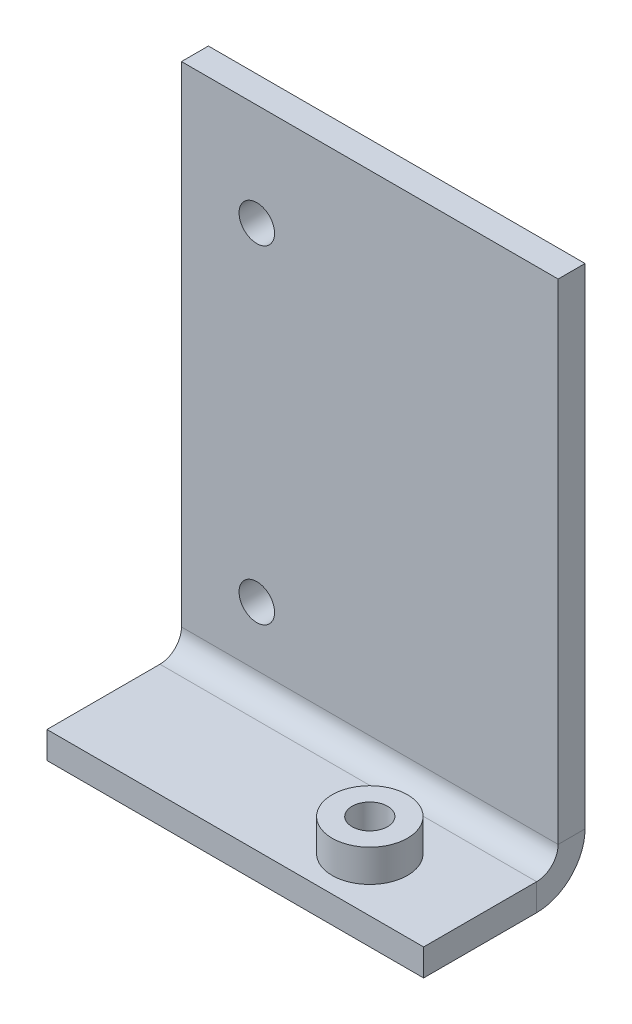
ISO-10303-21;
HEADER;
FILE_DESCRIPTION(('STEP AP214'),'2;1');
FILE_NAME('part.step','',(''),(''),'','','');
FILE_SCHEMA(('AUTOMOTIVE_DESIGN { 1 0 10303 214 1 1 1 1 }'));
ENDSEC;
DATA;
#1=APPLICATION_CONTEXT('core data for automotive mechanical design processes');
#2=APPLICATION_PROTOCOL_DEFINITION('international standard','automotive_design',2000,#1);
#3=PRODUCT_CONTEXT('',#1,'mechanical');
#4=PRODUCT('Part','Part','',(#3));
#5=PRODUCT_RELATED_PRODUCT_CATEGORY('part','',(#4));
#6=PRODUCT_DEFINITION_FORMATION('','',#4);
#7=PRODUCT_DEFINITION_CONTEXT('part definition',#1,'design');
#8=PRODUCT_DEFINITION('design','',#6,#7);
#9=PRODUCT_DEFINITION_SHAPE('','',#8);
#10=(LENGTH_UNIT() NAMED_UNIT(*) SI_UNIT(.MILLI.,.METRE.));
#11=(NAMED_UNIT(*) PLANE_ANGLE_UNIT() SI_UNIT($,.RADIAN.));
#12=(NAMED_UNIT(*) SI_UNIT($,.STERADIAN.) SOLID_ANGLE_UNIT());
#13=UNCERTAINTY_MEASURE_WITH_UNIT(LENGTH_MEASURE(1.E-05),#10,'distance_accuracy_value','');
#14=(GEOMETRIC_REPRESENTATION_CONTEXT(3) GLOBAL_UNCERTAINTY_ASSIGNED_CONTEXT((#13)) GLOBAL_UNIT_ASSIGNED_CONTEXT((#10,
#11,#12)) REPRESENTATION_CONTEXT('',''));
#15=CARTESIAN_POINT('',(0.,0.,0.));
#16=DIRECTION('',(0.,0.,1.));
#17=DIRECTION('',(1.,0.,0.));
#18=AXIS2_PLACEMENT_3D('',#15,#16,#17);
#19=CARTESIAN_POINT('',(35.,0.,2.5));
#20=DIRECTION('',(-1.,0.,0.));
#21=DIRECTION('',(0.,1.,0.));
#22=AXIS2_PLACEMENT_3D('',#19,#20,#21);
#23=PLANE('',#22);
#24=DIRECTION('',(0.,1.,0.));
#25=VECTOR('',#24,1.);
#26=CARTESIAN_POINT('',(35.,0.,2.5));
#27=LINE('',#26,#25);
#28=CARTESIAN_POINT('',(35.,4.49999999999999,2.5));
#29=VERTEX_POINT('',#28);
#30=CARTESIAN_POINT('',(35.,50.,2.5));
#31=VERTEX_POINT('',#30);
#32=EDGE_CURVE('E196',#29,#31,#27,.T.);
#33=ORIENTED_EDGE('',*,*,#32,.F.);
#34=DIRECTION('',(0.,0.,-1.));
#35=VECTOR('',#34,1.);
#36=CARTESIAN_POINT('',(35.,4.49999999999999,2.5));
#37=LINE('',#36,#35);
#38=CARTESIAN_POINT('',(35.,4.49999999999999,0.));
#39=VERTEX_POINT('',#38);
#40=EDGE_CURVE('E145',#29,#39,#37,.T.);
#41=ORIENTED_EDGE('',*,*,#40,.T.);
#42=DIRECTION('',(0.,1.,0.));
#43=VECTOR('',#42,1.);
#44=CARTESIAN_POINT('',(35.,0.,0.));
#45=LINE('',#44,#43);
#46=CARTESIAN_POINT('',(35.,50.,0.));
#47=VERTEX_POINT('',#46);
#48=EDGE_CURVE('E99',#39,#47,#45,.T.);
#49=ORIENTED_EDGE('',*,*,#48,.T.);
#50=DIRECTION('',(0.,0.,1.));
#51=VECTOR('',#50,1.);
#52=CARTESIAN_POINT('',(35.,50.,2.5));
#53=LINE('',#52,#51);
#54=EDGE_CURVE('E13',#47,#31,#53,.T.);
#55=ORIENTED_EDGE('',*,*,#54,.T.);
#56=EDGE_LOOP('',(#33,#41,#49,#55));
#57=FACE_BOUND('',#56,.T.);
#58=ADVANCED_FACE('F64',(#57),#23,.F.);
#59=CARTESIAN_POINT('',(0.,0.,2.5));
#60=DIRECTION('',(0.,0.,-1.));
#61=DIRECTION('',(-1.,0.,0.));
#62=AXIS2_PLACEMENT_3D('',#59,#60,#61);
#63=PLANE('',#62);
#64=CARTESIAN_POINT('',(7.00000000000003,40.5,2.5));
#65=DIRECTION('',(0.,0.,1.));
#66=DIRECTION('',(1.,0.,0.));
#67=AXIS2_PLACEMENT_3D('',#64,#65,#66);
#68=CIRCLE('',#67,1.65);
#69=CARTESIAN_POINT('',(8.65000000000003,40.5,2.5));
#70=VERTEX_POINT('',#69);
#71=EDGE_CURVE('E189',#70,#70,#68,.T.);
#72=ORIENTED_EDGE('',*,*,#71,.F.);
#73=EDGE_LOOP('',(#72));
#74=FACE_BOUND('',#73,.T.);
#75=CARTESIAN_POINT('',(7.00000000000035,10.,2.5));
#76=DIRECTION('',(0.,0.,1.));
#77=DIRECTION('',(1.,0.,0.));
#78=AXIS2_PLACEMENT_3D('',#75,#76,#77);
#79=CIRCLE('',#78,1.65);
#80=CARTESIAN_POINT('',(8.65000000000035,10.,2.5));
#81=VERTEX_POINT('',#80);
#82=EDGE_CURVE('E186',#81,#81,#79,.T.);
#83=ORIENTED_EDGE('',*,*,#82,.F.);
#84=EDGE_LOOP('',(#83));
#85=FACE_BOUND('',#84,.T.);
#86=DIRECTION('',(1.,0.,0.));
#87=VECTOR('',#86,1.);
#88=CARTESIAN_POINT('',(35.,4.49999999999999,2.5));
#89=LINE('',#88,#87);
#90=CARTESIAN_POINT('',(0.,4.49999999999999,2.5));
#91=VERTEX_POINT('',#90);
#92=EDGE_CURVE('E146',#29,#91,#89,.F.);
#93=ORIENTED_EDGE('',*,*,#92,.F.);
#94=ORIENTED_EDGE('',*,*,#32,.T.);
#95=DIRECTION('',(-1.,0.,0.));
#96=VECTOR('',#95,1.);
#97=CARTESIAN_POINT('',(0.,50.,2.5));
#98=LINE('',#97,#96);
#99=CARTESIAN_POINT('',(0.,50.,2.5));
#100=VERTEX_POINT('',#99);
#101=EDGE_CURVE('E198',#31,#100,#98,.T.);
#102=ORIENTED_EDGE('',*,*,#101,.T.);
#103=DIRECTION('',(0.,-1.,0.));
#104=VECTOR('',#103,1.);
#105=CARTESIAN_POINT('',(0.,0.,2.5));
#106=LINE('',#105,#104);
#107=EDGE_CURVE('E193',#100,#91,#106,.T.);
#108=ORIENTED_EDGE('',*,*,#107,.T.);
#109=EDGE_LOOP('',(#93,#94,#102,#108));
#110=FACE_BOUND('',#109,.T.);
#111=ADVANCED_FACE('F219',(#74,#85,#110),#63,.F.);
#112=CARTESIAN_POINT('',(0.,0.,0.));
#113=DIRECTION('',(0.,0.,-1.));
#114=DIRECTION('',(-1.,0.,0.));
#115=AXIS2_PLACEMENT_3D('',#112,#113,#114);
#116=PLANE('',#115);
#117=CARTESIAN_POINT('',(7.00000000000035,10.,0.));
#118=DIRECTION('',(0.,0.,1.));
#119=DIRECTION('',(1.,0.,0.));
#120=AXIS2_PLACEMENT_3D('',#117,#118,#119);
#121=CIRCLE('',#120,1.65);
#122=CARTESIAN_POINT('',(8.65000000000035,10.,0.));
#123=VERTEX_POINT('',#122);
#124=EDGE_CURVE('E184',#123,#123,#121,.T.);
#125=ORIENTED_EDGE('',*,*,#124,.T.);
#126=EDGE_LOOP('',(#125));
#127=FACE_BOUND('',#126,.T.);
#128=CARTESIAN_POINT('',(7.00000000000003,40.5,0.));
#129=DIRECTION('',(0.,0.,1.));
#130=DIRECTION('',(1.,0.,0.));
#131=AXIS2_PLACEMENT_3D('',#128,#129,#130);
#132=CIRCLE('',#131,1.65);
#133=CARTESIAN_POINT('',(8.65000000000003,40.5,0.));
#134=VERTEX_POINT('',#133);
#135=EDGE_CURVE('E203',#134,#134,#132,.T.);
#136=ORIENTED_EDGE('',*,*,#135,.T.);
#137=EDGE_LOOP('',(#136));
#138=FACE_BOUND('',#137,.T.);
#139=ORIENTED_EDGE('',*,*,#48,.F.);
#140=DIRECTION('',(1.,0.,0.));
#141=VECTOR('',#140,1.);
#142=CARTESIAN_POINT('',(35.,4.49999999999999,0.));
#143=LINE('',#142,#141);
#144=CARTESIAN_POINT('',(0.,4.50000000000001,0.));
#145=VERTEX_POINT('',#144);
#146=EDGE_CURVE('E105',#39,#145,#143,.F.);
#147=ORIENTED_EDGE('',*,*,#146,.T.);
#148=DIRECTION('',(0.,1.,0.));
#149=VECTOR('',#148,1.);
#150=CARTESIAN_POINT('',(0.,0.,0.));
#151=LINE('',#150,#149);
#152=CARTESIAN_POINT('',(0.,50.,0.));
#153=VERTEX_POINT('',#152);
#154=EDGE_CURVE('E206',#153,#145,#151,.F.);
#155=ORIENTED_EDGE('',*,*,#154,.F.);
#156=DIRECTION('',(-1.,0.,0.));
#157=VECTOR('',#156,1.);
#158=CARTESIAN_POINT('',(0.,50.,0.));
#159=LINE('',#158,#157);
#160=EDGE_CURVE('E190',#47,#153,#159,.T.);
#161=ORIENTED_EDGE('',*,*,#160,.F.);
#162=EDGE_LOOP('',(#139,#147,#155,#161));
#163=FACE_BOUND('',#162,.T.);
#164=ADVANCED_FACE('F214',(#127,#138,#163),#116,.T.);
#165=CARTESIAN_POINT('',(0.,50.,2.5));
#166=DIRECTION('',(0.,-1.,0.));
#167=DIRECTION('',(-1.,0.,0.));
#168=AXIS2_PLACEMENT_3D('',#165,#166,#167);
#169=PLANE('',#168);
#170=ORIENTED_EDGE('',*,*,#54,.F.);
#171=ORIENTED_EDGE('',*,*,#160,.T.);
#172=DIRECTION('',(0.,0.,1.));
#173=VECTOR('',#172,1.);
#174=CARTESIAN_POINT('',(0.,50.,2.5));
#175=LINE('',#174,#173);
#176=EDGE_CURVE('E71',#153,#100,#175,.T.);
#177=ORIENTED_EDGE('',*,*,#176,.T.);
#178=ORIENTED_EDGE('',*,*,#101,.F.);
#179=EDGE_LOOP('',(#170,#171,#177,#178));
#180=FACE_BOUND('',#179,.T.);
#181=ADVANCED_FACE('F211',(#180),#169,.F.);
#182=CARTESIAN_POINT('',(0.,0.,2.5));
#183=DIRECTION('',(1.,0.,0.));
#184=DIRECTION('',(0.,-1.,0.));
#185=AXIS2_PLACEMENT_3D('',#182,#183,#184);
#186=PLANE('',#185);
#187=DIRECTION('',(0.,0.,-1.));
#188=VECTOR('',#187,1.);
#189=CARTESIAN_POINT('',(0.,4.49999999999999,2.5));
#190=LINE('',#189,#188);
#191=EDGE_CURVE('E182',#91,#145,#190,.T.);
#192=ORIENTED_EDGE('',*,*,#191,.F.);
#193=ORIENTED_EDGE('',*,*,#107,.F.);
#194=ORIENTED_EDGE('',*,*,#176,.F.);
#195=ORIENTED_EDGE('',*,*,#154,.T.);
#196=EDGE_LOOP('',(#192,#193,#194,#195));
#197=FACE_BOUND('',#196,.T.);
#198=ADVANCED_FACE('F217',(#197),#186,.F.);
#199=CARTESIAN_POINT('',(7.00000000000035,10.,2.5));
#200=DIRECTION('',(0.,0.,-1.));
#201=DIRECTION('',(-1.,0.,0.));
#202=AXIS2_PLACEMENT_3D('',#199,#200,#201);
#203=CYLINDRICAL_SURFACE('',#202,1.65);
#204=ORIENTED_EDGE('',*,*,#82,.T.);
#205=EDGE_LOOP('',(#204));
#206=FACE_BOUND('',#205,.T.);
#207=ORIENTED_EDGE('',*,*,#124,.F.);
#208=EDGE_LOOP('',(#207));
#209=FACE_BOUND('',#208,.T.);
#210=ADVANCED_FACE('F238',(#206,#209),#203,.F.);
#211=CARTESIAN_POINT('',(7.00000000000003,40.5,2.5));
#212=DIRECTION('',(0.,0.,-1.));
#213=DIRECTION('',(-1.,0.,0.));
#214=AXIS2_PLACEMENT_3D('',#211,#212,#213);
#215=CYLINDRICAL_SURFACE('',#214,1.65);
#216=ORIENTED_EDGE('',*,*,#71,.T.);
#217=EDGE_LOOP('',(#216));
#218=FACE_BOUND('',#217,.T.);
#219=ORIENTED_EDGE('',*,*,#135,.F.);
#220=EDGE_LOOP('',(#219));
#221=FACE_BOUND('',#220,.T.);
#222=ADVANCED_FACE('F241',(#218,#221),#215,.F.);
#223=CARTESIAN_POINT('',(0.,4.49999999999999,4.5));
#224=DIRECTION('',(-1.,0.,0.));
#225=DIRECTION('',(0.,0.,1.));
#226=AXIS2_PLACEMENT_3D('',#223,#224,#225);
#227=PLANE('',#226);
#228=DIRECTION('',(0.,1.,0.));
#229=VECTOR('',#228,1.);
#230=CARTESIAN_POINT('',(0.,0.,4.49999999999998));
#231=LINE('',#230,#229);
#232=CARTESIAN_POINT('',(0.,2.49999999999999,4.49999999999999));
#233=VERTEX_POINT('',#232);
#234=CARTESIAN_POINT('',(0.,0.,4.49999999999998));
#235=VERTEX_POINT('',#234);
#236=EDGE_CURVE('E137',#233,#235,#231,.F.);
#237=ORIENTED_EDGE('',*,*,#236,.F.);
#238=CARTESIAN_POINT('',(0.,4.49999999999999,4.5));
#239=DIRECTION('',(1.,0.,0.));
#240=DIRECTION('',(0.,0.,-1.));
#241=AXIS2_PLACEMENT_3D('',#238,#239,#240);
#242=CIRCLE('',#241,2.);
#243=EDGE_CURVE('E131',#91,#233,#242,.F.);
#244=ORIENTED_EDGE('',*,*,#243,.F.);
#245=ORIENTED_EDGE('',*,*,#191,.T.);
#246=CARTESIAN_POINT('',(0.,4.49999999999999,4.5));
#247=DIRECTION('',(1.,0.,0.));
#248=DIRECTION('',(0.,0.,-1.));
#249=AXIS2_PLACEMENT_3D('',#246,#247,#248);
#250=CIRCLE('',#249,4.5);
#251=EDGE_CURVE('E78',#145,#235,#250,.F.);
#252=ORIENTED_EDGE('',*,*,#251,.T.);
#253=EDGE_LOOP('',(#237,#244,#245,#252));
#254=FACE_BOUND('',#253,.T.);
#255=ADVANCED_FACE('F244',(#254),#227,.T.);
#256=CARTESIAN_POINT('',(35.,4.49999999999999,4.5));
#257=DIRECTION('',(-1.,0.,0.));
#258=DIRECTION('',(0.,0.,1.));
#259=AXIS2_PLACEMENT_3D('',#256,#257,#258);
#260=PLANE('',#259);
#261=CARTESIAN_POINT('',(35.,4.49999999999999,4.5));
#262=DIRECTION('',(1.,0.,0.));
#263=DIRECTION('',(0.,0.,-1.));
#264=AXIS2_PLACEMENT_3D('',#261,#262,#263);
#265=CIRCLE('',#264,2.);
#266=CARTESIAN_POINT('',(35.,2.49999999999999,4.49999999999999));
#267=VERTEX_POINT('',#266);
#268=EDGE_CURVE('E128',#267,#29,#265,.T.);
#269=ORIENTED_EDGE('',*,*,#268,.F.);
#270=DIRECTION('',(0.,1.,0.));
#271=VECTOR('',#270,1.);
#272=CARTESIAN_POINT('',(35.,2.49999999999999,4.49999999999999));
#273=LINE('',#272,#271);
#274=CARTESIAN_POINT('',(35.,0.,4.49999999999998));
#275=VERTEX_POINT('',#274);
#276=EDGE_CURVE('E136',#267,#275,#273,.F.);
#277=ORIENTED_EDGE('',*,*,#276,.T.);
#278=CARTESIAN_POINT('',(35.,4.49999999999999,4.5));
#279=DIRECTION('',(1.,0.,0.));
#280=DIRECTION('',(0.,0.,-1.));
#281=AXIS2_PLACEMENT_3D('',#278,#279,#280);
#282=CIRCLE('',#281,4.5);
#283=EDGE_CURVE('E177',#275,#39,#282,.T.);
#284=ORIENTED_EDGE('',*,*,#283,.T.);
#285=ORIENTED_EDGE('',*,*,#40,.F.);
#286=EDGE_LOOP('',(#269,#277,#284,#285));
#287=FACE_BOUND('',#286,.T.);
#288=ADVANCED_FACE('F142',(#287),#260,.F.);
#289=CARTESIAN_POINT('',(35.,4.49999999999999,4.5));
#290=DIRECTION('',(1.,0.,0.));
#291=DIRECTION('',(0.,-1.,0.));
#292=AXIS2_PLACEMENT_3D('',#289,#290,#291);
#293=CYLINDRICAL_SURFACE('',#292,4.5);
#294=ORIENTED_EDGE('',*,*,#146,.F.);
#295=ORIENTED_EDGE('',*,*,#283,.F.);
#296=DIRECTION('',(1.,0.,0.));
#297=VECTOR('',#296,1.);
#298=CARTESIAN_POINT('',(0.,0.,4.49999999999998));
#299=LINE('',#298,#297);
#300=EDGE_CURVE('E159',#275,#235,#299,.F.);
#301=ORIENTED_EDGE('',*,*,#300,.T.);
#302=ORIENTED_EDGE('',*,*,#251,.F.);
#303=EDGE_LOOP('',(#294,#295,#301,#302));
#304=FACE_BOUND('',#303,.T.);
#305=ADVANCED_FACE('F303',(#304),#293,.T.);
#306=CARTESIAN_POINT('',(35.,4.49999999999999,4.5));
#307=DIRECTION('',(1.,0.,0.));
#308=DIRECTION('',(0.,-1.,0.));
#309=AXIS2_PLACEMENT_3D('',#306,#307,#308);
#310=CYLINDRICAL_SURFACE('',#309,2.);
#311=ORIENTED_EDGE('',*,*,#92,.T.);
#312=ORIENTED_EDGE('',*,*,#243,.T.);
#313=DIRECTION('',(1.,0.,0.));
#314=VECTOR('',#313,1.);
#315=CARTESIAN_POINT('',(0.,2.49999999999999,4.49999999999999));
#316=LINE('',#315,#314);
#317=EDGE_CURVE('E125',#233,#267,#316,.T.);
#318=ORIENTED_EDGE('',*,*,#317,.T.);
#319=ORIENTED_EDGE('',*,*,#268,.T.);
#320=EDGE_LOOP('',(#311,#312,#318,#319));
#321=FACE_BOUND('',#320,.T.);
#322=ADVANCED_FACE('F127',(#321),#310,.F.);
#323=CARTESIAN_POINT('',(0.,0.,2.49999999999999));
#324=DIRECTION('',(1.,0.,0.));
#325=DIRECTION('',(0.,0.,-1.));
#326=AXIS2_PLACEMENT_3D('',#323,#324,#325);
#327=PLANE('',#326);
#328=ORIENTED_EDGE('',*,*,#236,.T.);
#329=DIRECTION('',(0.,0.,-1.));
#330=VECTOR('',#329,1.);
#331=CARTESIAN_POINT('',(0.,0.,0.));
#332=LINE('',#331,#330);
#333=CARTESIAN_POINT('',(0.,0.,15.));
#334=VERTEX_POINT('',#333);
#335=EDGE_CURVE('E167',#334,#235,#332,.T.);
#336=ORIENTED_EDGE('',*,*,#335,.F.);
#337=DIRECTION('',(0.,1.,0.));
#338=VECTOR('',#337,1.);
#339=CARTESIAN_POINT('',(0.,0.,15.));
#340=LINE('',#339,#338);
#341=CARTESIAN_POINT('',(0.,2.49999999999996,15.));
#342=VERTEX_POINT('',#341);
#343=EDGE_CURVE('E434',#334,#342,#340,.T.);
#344=ORIENTED_EDGE('',*,*,#343,.T.);
#345=DIRECTION('',(0.,0.,1.));
#346=VECTOR('',#345,1.);
#347=CARTESIAN_POINT('',(0.,2.5,2.5));
#348=LINE('',#347,#346);
#349=EDGE_CURVE('E165',#342,#233,#348,.F.);
#350=ORIENTED_EDGE('',*,*,#349,.T.);
#351=EDGE_LOOP('',(#328,#336,#344,#350));
#352=FACE_BOUND('',#351,.T.);
#353=ADVANCED_FACE('F321',(#352),#327,.F.);
#354=CARTESIAN_POINT('',(35.,0.,15.));
#355=DIRECTION('',(-1.,0.,0.));
#356=DIRECTION('',(0.,0.,1.));
#357=AXIS2_PLACEMENT_3D('',#354,#355,#356);
#358=PLANE('',#357);
#359=ORIENTED_EDGE('',*,*,#276,.F.);
#360=DIRECTION('',(0.,0.,-1.));
#361=VECTOR('',#360,1.);
#362=CARTESIAN_POINT('',(35.,2.49999999999996,15.));
#363=LINE('',#362,#361);
#364=CARTESIAN_POINT('',(35.,2.49999999999996,15.));
#365=VERTEX_POINT('',#364);
#366=EDGE_CURVE('E155',#267,#365,#363,.F.);
#367=ORIENTED_EDGE('',*,*,#366,.T.);
#368=DIRECTION('',(0.,1.,0.));
#369=VECTOR('',#368,1.);
#370=CARTESIAN_POINT('',(35.,0.,15.));
#371=LINE('',#370,#369);
#372=CARTESIAN_POINT('',(35.,0.,15.));
#373=VERTEX_POINT('',#372);
#374=EDGE_CURVE('E147',#373,#365,#371,.T.);
#375=ORIENTED_EDGE('',*,*,#374,.F.);
#376=DIRECTION('',(0.,0.,1.));
#377=VECTOR('',#376,1.);
#378=CARTESIAN_POINT('',(35.,0.,0.));
#379=LINE('',#378,#377);
#380=EDGE_CURVE('E158',#275,#373,#379,.T.);
#381=ORIENTED_EDGE('',*,*,#380,.F.);
#382=EDGE_LOOP('',(#359,#367,#375,#381));
#383=FACE_BOUND('',#382,.T.);
#384=ADVANCED_FACE('F152',(#383),#358,.F.);
#385=CARTESIAN_POINT('',(0.,0.,0.));
#386=DIRECTION('',(0.,1.,0.));
#387=DIRECTION('',(0.,0.,1.));
#388=AXIS2_PLACEMENT_3D('',#385,#386,#387);
#389=PLANE('',#388);
#390=CARTESIAN_POINT('',(25.,0.,10.));
#391=DIRECTION('',(0.,1.,0.));
#392=DIRECTION('',(0.,0.,1.));
#393=AXIS2_PLACEMENT_3D('',#390,#391,#392);
#394=CIRCLE('',#393,1.65);
#395=CARTESIAN_POINT('',(25.,0.,11.65));
#396=VERTEX_POINT('',#395);
#397=EDGE_CURVE('E424',#396,#396,#394,.T.);
#398=ORIENTED_EDGE('',*,*,#397,.T.);
#399=EDGE_LOOP('',(#398));
#400=FACE_BOUND('',#399,.T.);
#401=ORIENTED_EDGE('',*,*,#300,.F.);
#402=ORIENTED_EDGE('',*,*,#380,.T.);
#403=DIRECTION('',(-1.,0.,0.));
#404=VECTOR('',#403,1.);
#405=CARTESIAN_POINT('',(0.,0.,15.));
#406=LINE('',#405,#404);
#407=EDGE_CURVE('E437',#373,#334,#406,.T.);
#408=ORIENTED_EDGE('',*,*,#407,.T.);
#409=ORIENTED_EDGE('',*,*,#335,.T.);
#410=EDGE_LOOP('',(#401,#402,#408,#409));
#411=FACE_BOUND('',#410,.T.);
#412=ADVANCED_FACE('F341',(#400,#411),#389,.F.);
#413=CARTESIAN_POINT('',(0.,2.50000000000001,0.));
#414=DIRECTION('',(0.,1.,0.));
#415=DIRECTION('',(0.,0.,1.));
#416=AXIS2_PLACEMENT_3D('',#413,#414,#415);
#417=PLANE('',#416);
#418=CARTESIAN_POINT('',(25.,2.49999999999997,9.99999999999999));
#419=DIRECTION('',(0.,1.,0.));
#420=DIRECTION('',(0.,0.,1.));
#421=AXIS2_PLACEMENT_3D('',#418,#419,#420);
#422=CIRCLE('',#421,3.5);
#423=CARTESIAN_POINT('',(25.,2.49999999999996,13.5));
#424=VERTEX_POINT('',#423);
#425=EDGE_CURVE('E425',#424,#424,#422,.T.);
#426=ORIENTED_EDGE('',*,*,#425,.F.);
#427=EDGE_LOOP('',(#426));
#428=FACE_BOUND('',#427,.T.);
#429=ORIENTED_EDGE('',*,*,#366,.F.);
#430=ORIENTED_EDGE('',*,*,#317,.F.);
#431=ORIENTED_EDGE('',*,*,#349,.F.);
#432=DIRECTION('',(1.,0.,0.));
#433=VECTOR('',#432,1.);
#434=CARTESIAN_POINT('',(0.,2.49999999999996,15.));
#435=LINE('',#434,#433);
#436=EDGE_CURVE('E164',#365,#342,#435,.F.);
#437=ORIENTED_EDGE('',*,*,#436,.F.);
#438=EDGE_LOOP('',(#429,#430,#431,#437));
#439=FACE_BOUND('',#438,.T.);
#440=ADVANCED_FACE('F162',(#428,#439),#417,.T.);
#441=CARTESIAN_POINT('',(0.,0.,15.));
#442=DIRECTION('',(0.,0.,-1.));
#443=DIRECTION('',(0.,1.,0.));
#444=AXIS2_PLACEMENT_3D('',#441,#442,#443);
#445=PLANE('',#444);
#446=ORIENTED_EDGE('',*,*,#436,.T.);
#447=ORIENTED_EDGE('',*,*,#343,.F.);
#448=ORIENTED_EDGE('',*,*,#407,.F.);
#449=ORIENTED_EDGE('',*,*,#374,.T.);
#450=EDGE_LOOP('',(#446,#447,#448,#449));
#451=FACE_BOUND('',#450,.T.);
#452=ADVANCED_FACE('F364',(#451),#445,.F.);
#453=CARTESIAN_POINT('',(25.,5.49999999999997,10.));
#454=DIRECTION('',(0.,-1.,0.));
#455=DIRECTION('',(0.,0.,-1.));
#456=AXIS2_PLACEMENT_3D('',#453,#454,#455);
#457=CYLINDRICAL_SURFACE('',#456,3.5);
#458=CARTESIAN_POINT('',(25.,5.49999999999997,10.));
#459=DIRECTION('',(0.,1.,0.));
#460=DIRECTION('',(0.,0.,1.));
#461=AXIS2_PLACEMENT_3D('',#458,#459,#460);
#462=CIRCLE('',#461,3.5);
#463=CARTESIAN_POINT('',(25.,5.49999999999996,13.5));
#464=VERTEX_POINT('',#463);
#465=EDGE_CURVE('E175',#464,#464,#462,.T.);
#466=ORIENTED_EDGE('',*,*,#465,.F.);
#467=EDGE_LOOP('',(#466));
#468=FACE_BOUND('',#467,.T.);
#469=ORIENTED_EDGE('',*,*,#425,.T.);
#470=EDGE_LOOP('',(#469));
#471=FACE_BOUND('',#470,.T.);
#472=ADVANCED_FACE('F374',(#468,#471),#457,.T.);
#473=CARTESIAN_POINT('',(25.,5.49999999999997,10.));
#474=DIRECTION('',(0.,1.,0.));
#475=DIRECTION('',(0.,0.,1.));
#476=AXIS2_PLACEMENT_3D('',#473,#474,#475);
#477=PLANE('',#476);
#478=CARTESIAN_POINT('',(25.,5.49999999999997,10.));
#479=DIRECTION('',(0.,1.,0.));
#480=DIRECTION('',(0.,0.,1.));
#481=AXIS2_PLACEMENT_3D('',#478,#479,#480);
#482=CIRCLE('',#481,1.65);
#483=CARTESIAN_POINT('',(25.,5.49999999999997,11.65));
#484=VERTEX_POINT('',#483);
#485=EDGE_CURVE('E421',#484,#484,#482,.T.);
#486=ORIENTED_EDGE('',*,*,#485,.F.);
#487=EDGE_LOOP('',(#486));
#488=FACE_BOUND('',#487,.T.);
#489=ORIENTED_EDGE('',*,*,#465,.T.);
#490=EDGE_LOOP('',(#489));
#491=FACE_BOUND('',#490,.T.);
#492=ADVANCED_FACE('F384',(#488,#491),#477,.T.);
#493=CARTESIAN_POINT('',(25.,-4.50000000000003,9.99999999999998));
#494=DIRECTION('',(0.,1.,0.));
#495=DIRECTION('',(0.,0.,1.));
#496=AXIS2_PLACEMENT_3D('',#493,#494,#495);
#497=CYLINDRICAL_SURFACE('',#496,1.65);
#498=ORIENTED_EDGE('',*,*,#485,.T.);
#499=EDGE_LOOP('',(#498));
#500=FACE_BOUND('',#499,.T.);
#501=ORIENTED_EDGE('',*,*,#397,.F.);
#502=EDGE_LOOP('',(#501));
#503=FACE_BOUND('',#502,.T.);
#504=ADVANCED_FACE('F393',(#500,#503),#497,.F.);
#505=CLOSED_SHELL('',(#58,#111,#164,#181,#198,#210,#222,#255,#288,#305,#322,#353,#384,#412,#440,
#452,#472,#492,#504));
#506=MANIFOLD_SOLID_BREP('B2',#505);
#507=ADVANCED_BREP_SHAPE_REPRESENTATION('',(#18,#506),#14);
#508=SHAPE_DEFINITION_REPRESENTATION(#9,#507);
ENDSEC;
END-ISO-10303-21;
